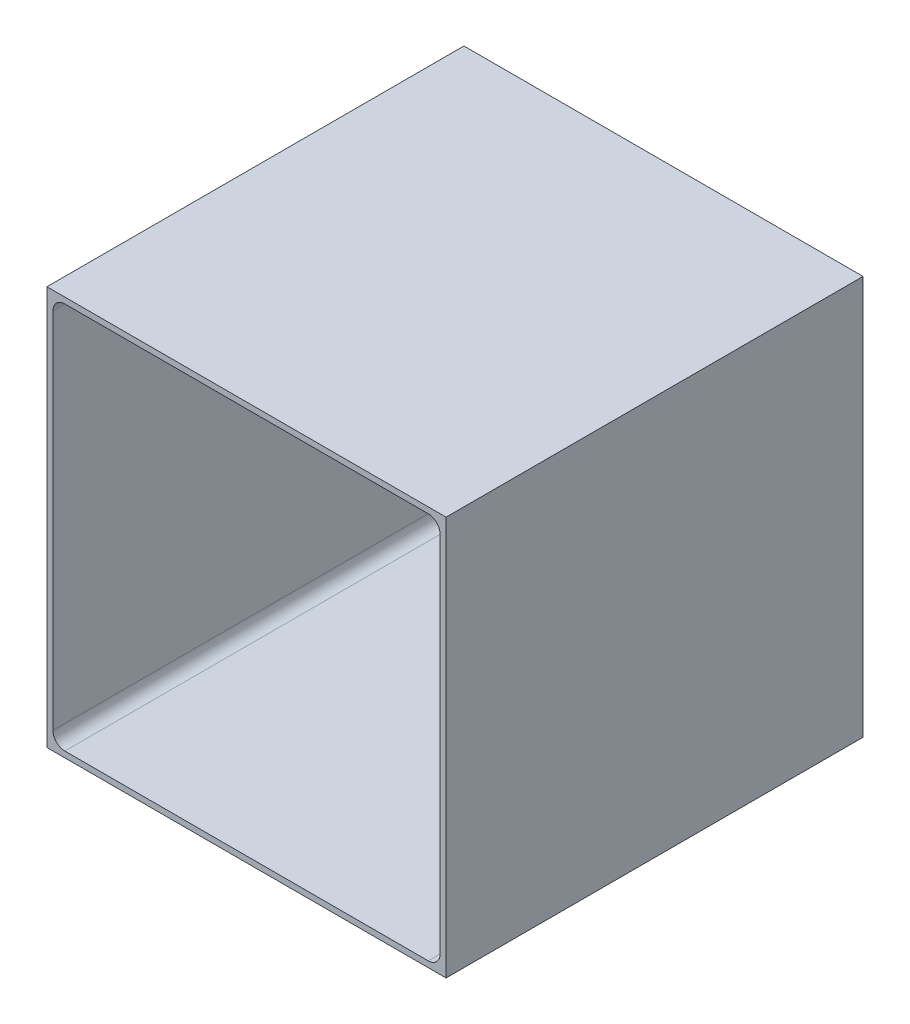
ISO-10303-21;
HEADER;
FILE_DESCRIPTION(('STEP AP214'),'2;1');
FILE_NAME('part.step','',(''),(''),'','','');
FILE_SCHEMA(('AUTOMOTIVE_DESIGN { 1 0 10303 214 1 1 1 1 }'));
ENDSEC;
DATA;
#1=APPLICATION_CONTEXT('core data for automotive mechanical design processes');
#2=APPLICATION_PROTOCOL_DEFINITION('international standard','automotive_design',2000,#1);
#3=PRODUCT_CONTEXT('',#1,'mechanical');
#4=PRODUCT('Part','Part','',(#3));
#5=PRODUCT_RELATED_PRODUCT_CATEGORY('part','',(#4));
#6=PRODUCT_DEFINITION_FORMATION('','',#4);
#7=PRODUCT_DEFINITION_CONTEXT('part definition',#1,'design');
#8=PRODUCT_DEFINITION('design','',#6,#7);
#9=PRODUCT_DEFINITION_SHAPE('','',#8);
#10=(LENGTH_UNIT() NAMED_UNIT(*) SI_UNIT(.MILLI.,.METRE.));
#11=(NAMED_UNIT(*) PLANE_ANGLE_UNIT() SI_UNIT($,.RADIAN.));
#12=(NAMED_UNIT(*) SI_UNIT($,.STERADIAN.) SOLID_ANGLE_UNIT());
#13=UNCERTAINTY_MEASURE_WITH_UNIT(LENGTH_MEASURE(1.E-05),#10,'distance_accuracy_value','');
#14=(GEOMETRIC_REPRESENTATION_CONTEXT(3) GLOBAL_UNCERTAINTY_ASSIGNED_CONTEXT((#13)) GLOBAL_UNIT_ASSIGNED_CONTEXT((#10,
#11,#12)) REPRESENTATION_CONTEXT('',''));
#15=CARTESIAN_POINT('',(0.,0.,0.));
#16=DIRECTION('',(0.,0.,1.));
#17=DIRECTION('',(1.,0.,0.));
#18=AXIS2_PLACEMENT_3D('',#15,#16,#17);
#19=CARTESIAN_POINT('',(0.,0.,4400.));
#20=DIRECTION('',(0.,0.,-1.));
#21=DIRECTION('',(-1.,0.,0.));
#22=AXIS2_PLACEMENT_3D('',#19,#20,#21);
#23=PLANE('',#22);
#24=DIRECTION('',(0.,1.,0.));
#25=VECTOR('',#24,1.);
#26=CARTESIAN_POINT('',(-335.,0.,4400.));
#27=LINE('',#26,#25);
#28=CARTESIAN_POINT('',(-335.,-335.,4400.));
#29=VERTEX_POINT('',#28);
#30=CARTESIAN_POINT('',(-335.,335.,4400.));
#31=VERTEX_POINT('',#30);
#32=EDGE_CURVE('E141',#29,#31,#27,.T.);
#33=ORIENTED_EDGE('',*,*,#32,.F.);
#34=DIRECTION('',(1.,0.,0.));
#35=VECTOR('',#34,1.);
#36=CARTESIAN_POINT('',(0.,-335.,4400.));
#37=LINE('',#36,#35);
#38=CARTESIAN_POINT('',(335.,-335.,4400.));
#39=VERTEX_POINT('',#38);
#40=EDGE_CURVE('E152',#29,#39,#37,.T.);
#41=ORIENTED_EDGE('',*,*,#40,.T.);
#42=DIRECTION('',(0.,1.,0.));
#43=VECTOR('',#42,1.);
#44=CARTESIAN_POINT('',(335.,0.,4400.));
#45=LINE('',#44,#43);
#46=CARTESIAN_POINT('',(335.,335.,4400.));
#47=VERTEX_POINT('',#46);
#48=EDGE_CURVE('E159',#39,#47,#45,.T.);
#49=ORIENTED_EDGE('',*,*,#48,.T.);
#50=DIRECTION('',(1.,0.,0.));
#51=VECTOR('',#50,1.);
#52=CARTESIAN_POINT('',(0.,335.,4400.));
#53=LINE('',#52,#51);
#54=EDGE_CURVE('E162',#31,#47,#53,.T.);
#55=ORIENTED_EDGE('',*,*,#54,.F.);
#56=EDGE_LOOP('',(#33,#41,#49,#55));
#57=FACE_BOUND('',#56,.T.);
#58=DIRECTION('',(1.,0.,0.));
#59=VECTOR('',#58,1.);
#60=CARTESIAN_POINT('',(-325.,-325.,4400.));
#61=LINE('',#60,#59);
#62=CARTESIAN_POINT('',(-305.,-325.,4400.));
#63=VERTEX_POINT('',#62);
#64=CARTESIAN_POINT('',(305.,-325.,4400.));
#65=VERTEX_POINT('',#64);
#66=EDGE_CURVE('E178',#63,#65,#61,.T.);
#67=ORIENTED_EDGE('',*,*,#66,.F.);
#68=CARTESIAN_POINT('',(-305.,-305.,4400.));
#69=DIRECTION('',(0.,0.,-1.));
#70=DIRECTION('',(-1.,0.,0.));
#71=AXIS2_PLACEMENT_3D('',#68,#69,#70);
#72=CIRCLE('',#71,20.);
#73=CARTESIAN_POINT('',(-325.,-305.,4400.));
#74=VERTEX_POINT('',#73);
#75=EDGE_CURVE('E55',#63,#74,#72,.T.);
#76=ORIENTED_EDGE('',*,*,#75,.T.);
#77=DIRECTION('',(0.,1.,0.));
#78=VECTOR('',#77,1.);
#79=CARTESIAN_POINT('',(-325.,-325.,4400.));
#80=LINE('',#79,#78);
#81=CARTESIAN_POINT('',(-325.,305.,4400.));
#82=VERTEX_POINT('',#81);
#83=EDGE_CURVE('E188',#74,#82,#80,.T.);
#84=ORIENTED_EDGE('',*,*,#83,.T.);
#85=CARTESIAN_POINT('',(-305.,305.,4400.));
#86=DIRECTION('',(0.,0.,-1.));
#87=DIRECTION('',(-1.,0.,0.));
#88=AXIS2_PLACEMENT_3D('',#85,#86,#87);
#89=CIRCLE('',#88,20.);
#90=CARTESIAN_POINT('',(-305.,325.,4400.));
#91=VERTEX_POINT('',#90);
#92=EDGE_CURVE('E217',#82,#91,#89,.T.);
#93=ORIENTED_EDGE('',*,*,#92,.T.);
#94=DIRECTION('',(1.,0.,0.));
#95=VECTOR('',#94,1.);
#96=CARTESIAN_POINT('',(-325.,325.,4400.));
#97=LINE('',#96,#95);
#98=CARTESIAN_POINT('',(305.,325.,4400.));
#99=VERTEX_POINT('',#98);
#100=EDGE_CURVE('E196',#91,#99,#97,.T.);
#101=ORIENTED_EDGE('',*,*,#100,.T.);
#102=CARTESIAN_POINT('',(305.,305.,4400.));
#103=DIRECTION('',(0.,0.,-1.));
#104=DIRECTION('',(-1.,0.,0.));
#105=AXIS2_PLACEMENT_3D('',#102,#103,#104);
#106=CIRCLE('',#105,20.);
#107=CARTESIAN_POINT('',(325.,305.,4400.));
#108=VERTEX_POINT('',#107);
#109=EDGE_CURVE('E221',#99,#108,#106,.T.);
#110=ORIENTED_EDGE('',*,*,#109,.T.);
#111=DIRECTION('',(0.,1.,0.));
#112=VECTOR('',#111,1.);
#113=CARTESIAN_POINT('',(325.,-325.,4400.));
#114=LINE('',#113,#112);
#115=CARTESIAN_POINT('',(325.,-305.,4400.));
#116=VERTEX_POINT('',#115);
#117=EDGE_CURVE('E192',#116,#108,#114,.T.);
#118=ORIENTED_EDGE('',*,*,#117,.F.);
#119=CARTESIAN_POINT('',(305.,-305.,4400.));
#120=DIRECTION('',(0.,0.,-1.));
#121=DIRECTION('',(-1.,0.,0.));
#122=AXIS2_PLACEMENT_3D('',#119,#120,#121);
#123=CIRCLE('',#122,20.);
#124=EDGE_CURVE('E62',#116,#65,#123,.T.);
#125=ORIENTED_EDGE('',*,*,#124,.T.);
#126=EDGE_LOOP('',(#67,#76,#84,#93,#101,#110,#118,#125));
#127=FACE_BOUND('',#126,.T.);
#128=ADVANCED_FACE('F47',(#57,#127),#23,.F.);
#129=CARTESIAN_POINT('',(0.,0.,3700.));
#130=DIRECTION('',(0.,0.,-1.));
#131=DIRECTION('',(-1.,0.,0.));
#132=AXIS2_PLACEMENT_3D('',#129,#130,#131);
#133=PLANE('',#132);
#134=DIRECTION('',(0.,-1.,0.));
#135=VECTOR('',#134,1.);
#136=CARTESIAN_POINT('',(-325.,-325.,3700.));
#137=LINE('',#136,#135);
#138=CARTESIAN_POINT('',(-325.,305.,3700.));
#139=VERTEX_POINT('',#138);
#140=CARTESIAN_POINT('',(-325.,-305.,3700.));
#141=VERTEX_POINT('',#140);
#142=EDGE_CURVE('E244',#139,#141,#137,.T.);
#143=ORIENTED_EDGE('',*,*,#142,.T.);
#144=CARTESIAN_POINT('',(-305.,-305.,3700.));
#145=DIRECTION('',(0.,0.,-1.));
#146=DIRECTION('',(-1.,0.,0.));
#147=AXIS2_PLACEMENT_3D('',#144,#145,#146);
#148=CIRCLE('',#147,20.);
#149=CARTESIAN_POINT('',(-305.,-325.,3700.));
#150=VERTEX_POINT('',#149);
#151=EDGE_CURVE('E12',#141,#150,#148,.F.);
#152=ORIENTED_EDGE('',*,*,#151,.T.);
#153=DIRECTION('',(1.,0.,0.));
#154=VECTOR('',#153,1.);
#155=CARTESIAN_POINT('',(325.,-325.,3700.));
#156=LINE('',#155,#154);
#157=CARTESIAN_POINT('',(305.,-325.,3700.));
#158=VERTEX_POINT('',#157);
#159=EDGE_CURVE('E211',#150,#158,#156,.T.);
#160=ORIENTED_EDGE('',*,*,#159,.T.);
#161=CARTESIAN_POINT('',(305.,-305.,3700.));
#162=DIRECTION('',(0.,0.,-1.));
#163=DIRECTION('',(-1.,0.,0.));
#164=AXIS2_PLACEMENT_3D('',#161,#162,#163);
#165=CIRCLE('',#164,20.);
#166=CARTESIAN_POINT('',(325.,-305.,3700.));
#167=VERTEX_POINT('',#166);
#168=EDGE_CURVE('E226',#158,#167,#165,.F.);
#169=ORIENTED_EDGE('',*,*,#168,.T.);
#170=DIRECTION('',(0.,1.,0.));
#171=VECTOR('',#170,1.);
#172=CARTESIAN_POINT('',(325.,-325.,3700.));
#173=LINE('',#172,#171);
#174=CARTESIAN_POINT('',(325.,305.,3700.));
#175=VERTEX_POINT('',#174);
#176=EDGE_CURVE('E184',#167,#175,#173,.T.);
#177=ORIENTED_EDGE('',*,*,#176,.T.);
#178=CARTESIAN_POINT('',(305.,305.,3700.));
#179=DIRECTION('',(0.,0.,-1.));
#180=DIRECTION('',(-1.,0.,0.));
#181=AXIS2_PLACEMENT_3D('',#178,#179,#180);
#182=CIRCLE('',#181,20.);
#183=CARTESIAN_POINT('',(305.,325.,3700.));
#184=VERTEX_POINT('',#183);
#185=EDGE_CURVE('E223',#175,#184,#182,.F.);
#186=ORIENTED_EDGE('',*,*,#185,.T.);
#187=DIRECTION('',(-1.,0.,0.));
#188=VECTOR('',#187,1.);
#189=CARTESIAN_POINT('',(325.,325.,3700.));
#190=LINE('',#189,#188);
#191=CARTESIAN_POINT('',(-305.,325.,3700.));
#192=VERTEX_POINT('',#191);
#193=EDGE_CURVE('E189',#184,#192,#190,.T.);
#194=ORIENTED_EDGE('',*,*,#193,.T.);
#195=CARTESIAN_POINT('',(-305.,305.,3700.));
#196=DIRECTION('',(0.,0.,-1.));
#197=DIRECTION('',(-1.,0.,0.));
#198=AXIS2_PLACEMENT_3D('',#195,#196,#197);
#199=CIRCLE('',#198,20.);
#200=EDGE_CURVE('E219',#192,#139,#199,.F.);
#201=ORIENTED_EDGE('',*,*,#200,.T.);
#202=EDGE_LOOP('',(#143,#152,#160,#169,#177,#186,#194,#201));
#203=FACE_BOUND('',#202,.T.);
#204=DIRECTION('',(1.,0.,0.));
#205=VECTOR('',#204,1.);
#206=CARTESIAN_POINT('',(0.,-335.,3700.));
#207=LINE('',#206,#205);
#208=CARTESIAN_POINT('',(-335.,-335.,3700.));
#209=VERTEX_POINT('',#208);
#210=CARTESIAN_POINT('',(335.,-335.,3700.));
#211=VERTEX_POINT('',#210);
#212=EDGE_CURVE('E173',#209,#211,#207,.T.);
#213=ORIENTED_EDGE('',*,*,#212,.F.);
#214=DIRECTION('',(0.,-1.,0.));
#215=VECTOR('',#214,1.);
#216=CARTESIAN_POINT('',(-335.,0.,3700.));
#217=LINE('',#216,#215);
#218=CARTESIAN_POINT('',(-335.,335.,3700.));
#219=VERTEX_POINT('',#218);
#220=EDGE_CURVE('E144',#219,#209,#217,.T.);
#221=ORIENTED_EDGE('',*,*,#220,.F.);
#222=DIRECTION('',(-1.,0.,0.));
#223=VECTOR('',#222,1.);
#224=CARTESIAN_POINT('',(0.,335.,3700.));
#225=LINE('',#224,#223);
#226=CARTESIAN_POINT('',(335.,335.,3700.));
#227=VERTEX_POINT('',#226);
#228=EDGE_CURVE('E172',#227,#219,#225,.T.);
#229=ORIENTED_EDGE('',*,*,#228,.F.);
#230=DIRECTION('',(0.,1.,0.));
#231=VECTOR('',#230,1.);
#232=CARTESIAN_POINT('',(335.,0.,3700.));
#233=LINE('',#232,#231);
#234=EDGE_CURVE('E149',#211,#227,#233,.T.);
#235=ORIENTED_EDGE('',*,*,#234,.F.);
#236=EDGE_LOOP('',(#213,#221,#229,#235));
#237=FACE_BOUND('',#236,.T.);
#238=ADVANCED_FACE('F261',(#203,#237),#133,.T.);
#239=CARTESIAN_POINT('',(-335.,0.,0.));
#240=DIRECTION('',(-1.,0.,0.));
#241=DIRECTION('',(0.,0.,1.));
#242=AXIS2_PLACEMENT_3D('',#239,#240,#241);
#243=PLANE('',#242);
#244=DIRECTION('',(0.,0.,1.));
#245=VECTOR('',#244,1.);
#246=CARTESIAN_POINT('',(-335.,-335.,0.));
#247=LINE('',#246,#245);
#248=EDGE_CURVE('E136',#209,#29,#247,.T.);
#249=ORIENTED_EDGE('',*,*,#248,.T.);
#250=ORIENTED_EDGE('',*,*,#32,.T.);
#251=DIRECTION('',(0.,0.,1.));
#252=VECTOR('',#251,1.);
#253=CARTESIAN_POINT('',(-335.,335.,0.));
#254=LINE('',#253,#252);
#255=EDGE_CURVE('E148',#219,#31,#254,.T.);
#256=ORIENTED_EDGE('',*,*,#255,.F.);
#257=ORIENTED_EDGE('',*,*,#220,.T.);
#258=EDGE_LOOP('',(#249,#250,#256,#257));
#259=FACE_BOUND('',#258,.T.);
#260=ADVANCED_FACE('F138',(#259),#243,.T.);
#261=CARTESIAN_POINT('',(0.,335.,0.));
#262=DIRECTION('',(0.,1.,0.));
#263=DIRECTION('',(0.,0.,1.));
#264=AXIS2_PLACEMENT_3D('',#261,#262,#263);
#265=PLANE('',#264);
#266=ORIENTED_EDGE('',*,*,#255,.T.);
#267=ORIENTED_EDGE('',*,*,#54,.T.);
#268=DIRECTION('',(0.,0.,1.));
#269=VECTOR('',#268,1.);
#270=CARTESIAN_POINT('',(335.,335.,0.));
#271=LINE('',#270,#269);
#272=EDGE_CURVE('E163',#227,#47,#271,.T.);
#273=ORIENTED_EDGE('',*,*,#272,.F.);
#274=ORIENTED_EDGE('',*,*,#228,.T.);
#275=EDGE_LOOP('',(#266,#267,#273,#274));
#276=FACE_BOUND('',#275,.T.);
#277=ADVANCED_FACE('F296',(#276),#265,.T.);
#278=CARTESIAN_POINT('',(0.,-335.,0.));
#279=DIRECTION('',(0.,1.,0.));
#280=DIRECTION('',(0.,0.,1.));
#281=AXIS2_PLACEMENT_3D('',#278,#279,#280);
#282=PLANE('',#281);
#283=DIRECTION('',(0.,0.,1.));
#284=VECTOR('',#283,1.);
#285=CARTESIAN_POINT('',(335.,-335.,0.));
#286=LINE('',#285,#284);
#287=EDGE_CURVE('E155',#211,#39,#286,.T.);
#288=ORIENTED_EDGE('',*,*,#287,.T.);
#289=ORIENTED_EDGE('',*,*,#40,.F.);
#290=ORIENTED_EDGE('',*,*,#248,.F.);
#291=ORIENTED_EDGE('',*,*,#212,.T.);
#292=EDGE_LOOP('',(#288,#289,#290,#291));
#293=FACE_BOUND('',#292,.T.);
#294=ADVANCED_FACE('F153',(#293),#282,.F.);
#295=CARTESIAN_POINT('',(335.,0.,0.));
#296=DIRECTION('',(-1.,0.,0.));
#297=DIRECTION('',(0.,0.,1.));
#298=AXIS2_PLACEMENT_3D('',#295,#296,#297);
#299=PLANE('',#298);
#300=ORIENTED_EDGE('',*,*,#272,.T.);
#301=ORIENTED_EDGE('',*,*,#48,.F.);
#302=ORIENTED_EDGE('',*,*,#287,.F.);
#303=ORIENTED_EDGE('',*,*,#234,.T.);
#304=EDGE_LOOP('',(#300,#301,#302,#303));
#305=FACE_BOUND('',#304,.T.);
#306=ADVANCED_FACE('F302',(#305),#299,.F.);
#307=CARTESIAN_POINT('',(-325.,0.,0.));
#308=DIRECTION('',(-1.,0.,0.));
#309=DIRECTION('',(0.,0.,1.));
#310=AXIS2_PLACEMENT_3D('',#307,#308,#309);
#311=PLANE('',#310);
#312=ORIENTED_EDGE('',*,*,#142,.F.);
#313=DIRECTION('',(0.,0.,1.));
#314=VECTOR('',#313,1.);
#315=CARTESIAN_POINT('',(-325.,305.,4400.));
#316=LINE('',#315,#314);
#317=EDGE_CURVE('E235',#139,#82,#316,.T.);
#318=ORIENTED_EDGE('',*,*,#317,.T.);
#319=ORIENTED_EDGE('',*,*,#83,.F.);
#320=DIRECTION('',(0.,0.,1.));
#321=VECTOR('',#320,1.);
#322=CARTESIAN_POINT('',(-325.,-305.,0.));
#323=LINE('',#322,#321);
#324=EDGE_CURVE('E158',#74,#141,#323,.F.);
#325=ORIENTED_EDGE('',*,*,#324,.T.);
#326=EDGE_LOOP('',(#312,#318,#319,#325));
#327=FACE_BOUND('',#326,.T.);
#328=ADVANCED_FACE('F232',(#327),#311,.F.);
#329=CARTESIAN_POINT('',(0.,325.,0.));
#330=DIRECTION('',(0.,1.,0.));
#331=DIRECTION('',(0.,0.,1.));
#332=AXIS2_PLACEMENT_3D('',#329,#330,#331);
#333=PLANE('',#332);
#334=ORIENTED_EDGE('',*,*,#100,.F.);
#335=DIRECTION('',(0.,0.,1.));
#336=VECTOR('',#335,1.);
#337=CARTESIAN_POINT('',(-305.,325.,3700.));
#338=LINE('',#337,#336);
#339=EDGE_CURVE('E190',#91,#192,#338,.F.);
#340=ORIENTED_EDGE('',*,*,#339,.T.);
#341=ORIENTED_EDGE('',*,*,#193,.F.);
#342=DIRECTION('',(0.,0.,1.));
#343=VECTOR('',#342,1.);
#344=CARTESIAN_POINT('',(305.,325.,0.));
#345=LINE('',#344,#343);
#346=EDGE_CURVE('E239',#184,#99,#345,.T.);
#347=ORIENTED_EDGE('',*,*,#346,.T.);
#348=EDGE_LOOP('',(#334,#340,#341,#347));
#349=FACE_BOUND('',#348,.T.);
#350=ADVANCED_FACE('F266',(#349),#333,.F.);
#351=CARTESIAN_POINT('',(0.,-325.,0.));
#352=DIRECTION('',(0.,1.,0.));
#353=DIRECTION('',(0.,0.,1.));
#354=AXIS2_PLACEMENT_3D('',#351,#352,#353);
#355=PLANE('',#354);
#356=ORIENTED_EDGE('',*,*,#66,.T.);
#357=DIRECTION('',(0.,0.,1.));
#358=VECTOR('',#357,1.);
#359=CARTESIAN_POINT('',(305.,-325.,3700.));
#360=LINE('',#359,#358);
#361=EDGE_CURVE('E214',#65,#158,#360,.F.);
#362=ORIENTED_EDGE('',*,*,#361,.T.);
#363=ORIENTED_EDGE('',*,*,#159,.F.);
#364=DIRECTION('',(0.,0.,1.));
#365=VECTOR('',#364,1.);
#366=CARTESIAN_POINT('',(-305.,-325.,0.));
#367=LINE('',#366,#365);
#368=EDGE_CURVE('E212',#150,#63,#367,.T.);
#369=ORIENTED_EDGE('',*,*,#368,.T.);
#370=EDGE_LOOP('',(#356,#362,#363,#369));
#371=FACE_BOUND('',#370,.T.);
#372=ADVANCED_FACE('F277',(#371),#355,.T.);
#373=CARTESIAN_POINT('',(325.,0.,0.));
#374=DIRECTION('',(-1.,0.,0.));
#375=DIRECTION('',(0.,0.,1.));
#376=AXIS2_PLACEMENT_3D('',#373,#374,#375);
#377=PLANE('',#376);
#378=ORIENTED_EDGE('',*,*,#117,.T.);
#379=DIRECTION('',(0.,0.,1.));
#380=VECTOR('',#379,1.);
#381=CARTESIAN_POINT('',(325.,305.,0.));
#382=LINE('',#381,#380);
#383=EDGE_CURVE('E215',#108,#175,#382,.F.);
#384=ORIENTED_EDGE('',*,*,#383,.T.);
#385=ORIENTED_EDGE('',*,*,#176,.F.);
#386=DIRECTION('',(0.,0.,1.));
#387=VECTOR('',#386,1.);
#388=CARTESIAN_POINT('',(325.,-305.,4400.));
#389=LINE('',#388,#387);
#390=EDGE_CURVE('E197',#167,#116,#389,.T.);
#391=ORIENTED_EDGE('',*,*,#390,.T.);
#392=EDGE_LOOP('',(#378,#384,#385,#391));
#393=FACE_BOUND('',#392,.T.);
#394=ADVANCED_FACE('F257',(#393),#377,.T.);
#395=CARTESIAN_POINT('',(-305.,305.,0.));
#396=DIRECTION('',(0.,0.,-1.));
#397=DIRECTION('',(-1.,0.,0.));
#398=AXIS2_PLACEMENT_3D('',#395,#396,#397);
#399=CYLINDRICAL_SURFACE('',#398,20.);
#400=ORIENTED_EDGE('',*,*,#200,.F.);
#401=ORIENTED_EDGE('',*,*,#339,.F.);
#402=ORIENTED_EDGE('',*,*,#92,.F.);
#403=ORIENTED_EDGE('',*,*,#317,.F.);
#404=EDGE_LOOP('',(#400,#401,#402,#403));
#405=FACE_BOUND('',#404,.T.);
#406=ADVANCED_FACE('F269',(#405),#399,.F.);
#407=CARTESIAN_POINT('',(305.,305.,0.));
#408=DIRECTION('',(0.,0.,1.));
#409=DIRECTION('',(1.,0.,0.));
#410=AXIS2_PLACEMENT_3D('',#407,#408,#409);
#411=CYLINDRICAL_SURFACE('',#410,20.);
#412=ORIENTED_EDGE('',*,*,#185,.F.);
#413=ORIENTED_EDGE('',*,*,#383,.F.);
#414=ORIENTED_EDGE('',*,*,#109,.F.);
#415=ORIENTED_EDGE('',*,*,#346,.F.);
#416=EDGE_LOOP('',(#412,#413,#414,#415));
#417=FACE_BOUND('',#416,.T.);
#418=ADVANCED_FACE('F265',(#417),#411,.F.);
#419=CARTESIAN_POINT('',(305.,-305.,0.));
#420=DIRECTION('',(0.,0.,-1.));
#421=DIRECTION('',(-1.,0.,0.));
#422=AXIS2_PLACEMENT_3D('',#419,#420,#421);
#423=CYLINDRICAL_SURFACE('',#422,20.);
#424=ORIENTED_EDGE('',*,*,#168,.F.);
#425=ORIENTED_EDGE('',*,*,#361,.F.);
#426=ORIENTED_EDGE('',*,*,#124,.F.);
#427=ORIENTED_EDGE('',*,*,#390,.F.);
#428=EDGE_LOOP('',(#424,#425,#426,#427));
#429=FACE_BOUND('',#428,.T.);
#430=ADVANCED_FACE('F276',(#429),#423,.F.);
#431=CARTESIAN_POINT('',(-305.,-305.,0.));
#432=DIRECTION('',(0.,0.,1.));
#433=DIRECTION('',(1.,0.,0.));
#434=AXIS2_PLACEMENT_3D('',#431,#432,#433);
#435=CYLINDRICAL_SURFACE('',#434,20.);
#436=ORIENTED_EDGE('',*,*,#151,.F.);
#437=ORIENTED_EDGE('',*,*,#324,.F.);
#438=ORIENTED_EDGE('',*,*,#75,.F.);
#439=ORIENTED_EDGE('',*,*,#368,.F.);
#440=EDGE_LOOP('',(#436,#437,#438,#439));
#441=FACE_BOUND('',#440,.T.);
#442=ADVANCED_FACE('F49',(#441),#435,.F.);
#443=CLOSED_SHELL('',(#128,#238,#260,#277,#294,#306,#328,#350,#372,#394,#406,#418,#430,#442));
#444=MANIFOLD_SOLID_BREP('B2',#443);
#445=ADVANCED_BREP_SHAPE_REPRESENTATION('',(#18,#444),#14);
#446=SHAPE_DEFINITION_REPRESENTATION(#9,#445);
ENDSEC;
END-ISO-10303-21;
